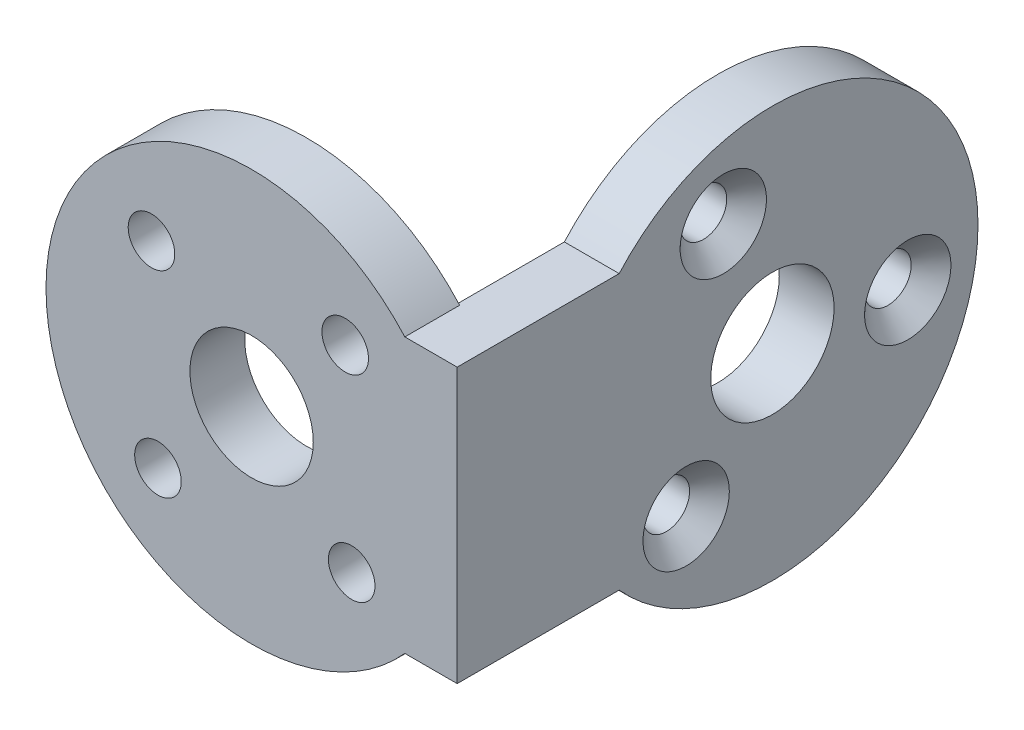
ISO-10303-21;
HEADER;
FILE_DESCRIPTION(('STEP AP214'),'2;1');
FILE_NAME('part.step','',(''),(''),'','','');
FILE_SCHEMA(('AUTOMOTIVE_DESIGN { 1 0 10303 214 1 1 1 1 }'));
ENDSEC;
DATA;
#1=APPLICATION_CONTEXT('core data for automotive mechanical design processes');
#2=APPLICATION_PROTOCOL_DEFINITION('international standard','automotive_design',2000,#1);
#3=PRODUCT_CONTEXT('',#1,'mechanical');
#4=PRODUCT('Part','Part','',(#3));
#5=PRODUCT_RELATED_PRODUCT_CATEGORY('part','',(#4));
#6=PRODUCT_DEFINITION_FORMATION('','',#4);
#7=PRODUCT_DEFINITION_CONTEXT('part definition',#1,'design');
#8=PRODUCT_DEFINITION('design','',#6,#7);
#9=PRODUCT_DEFINITION_SHAPE('','',#8);
#10=(LENGTH_UNIT() NAMED_UNIT(*) SI_UNIT(.MILLI.,.METRE.));
#11=(NAMED_UNIT(*) PLANE_ANGLE_UNIT() SI_UNIT($,.RADIAN.));
#12=(NAMED_UNIT(*) SI_UNIT($,.STERADIAN.) SOLID_ANGLE_UNIT());
#13=UNCERTAINTY_MEASURE_WITH_UNIT(LENGTH_MEASURE(1.E-05),#10,'distance_accuracy_value','');
#14=(GEOMETRIC_REPRESENTATION_CONTEXT(3) GLOBAL_UNCERTAINTY_ASSIGNED_CONTEXT((#13)) GLOBAL_UNIT_ASSIGNED_CONTEXT((#10,
#11,#12)) REPRESENTATION_CONTEXT('',''));
#15=CARTESIAN_POINT('',(0.,0.,0.));
#16=DIRECTION('',(0.,0.,1.));
#17=DIRECTION('',(1.,0.,0.));
#18=AXIS2_PLACEMENT_3D('',#15,#16,#17);
#19=CARTESIAN_POINT('',(0.,0.,4.));
#20=DIRECTION('',(0.,0.,1.));
#21=DIRECTION('',(1.,0.,0.));
#22=AXIS2_PLACEMENT_3D('',#19,#20,#21);
#23=PLANE('',#22);
#24=CARTESIAN_POINT('',(6.8308160540594,7.30342057091089,4.));
#25=DIRECTION('',(0.,0.,-1.));
#26=DIRECTION('',(-1.,0.,0.));
#27=AXIS2_PLACEMENT_3D('',#24,#25,#26);
#28=CIRCLE('',#27,1.7);
#29=CARTESIAN_POINT('',(5.1308160540594,7.30342057091089,4.));
#30=VERTEX_POINT('',#29);
#31=EDGE_CURVE('E177',#30,#30,#28,.T.);
#32=ORIENTED_EDGE('',*,*,#31,.T.);
#33=EDGE_LOOP('',(#32));
#34=FACE_BOUND('',#33,.T.);
#35=CARTESIAN_POINT('',(-7.30342057091105,6.83081605405923,4.));
#36=DIRECTION('',(0.,0.,-1.));
#37=DIRECTION('',(-1.,0.,0.));
#38=AXIS2_PLACEMENT_3D('',#35,#36,#37);
#39=CIRCLE('',#38,1.7);
#40=CARTESIAN_POINT('',(-9.00342057091105,6.83081605405923,4.));
#41=VERTEX_POINT('',#40);
#42=EDGE_CURVE('E186',#41,#41,#39,.T.);
#43=ORIENTED_EDGE('',*,*,#42,.T.);
#44=EDGE_LOOP('',(#43));
#45=FACE_BOUND('',#44,.T.);
#46=CARTESIAN_POINT('',(0.,0.,4.));
#47=DIRECTION('',(0.,0.,1.));
#48=DIRECTION('',(1.,0.,0.));
#49=AXIS2_PLACEMENT_3D('',#46,#47,#48);
#50=CIRCLE('',#49,15.);
#51=CARTESIAN_POINT('',(11.1803398874989,10.,4.));
#52=VERTEX_POINT('',#51);
#53=CARTESIAN_POINT('',(11.1803398874989,-10.,4.));
#54=VERTEX_POINT('',#53);
#55=EDGE_CURVE('E136',#52,#54,#50,.T.);
#56=ORIENTED_EDGE('',*,*,#55,.T.);
#57=DIRECTION('',(1.,0.,0.));
#58=VECTOR('',#57,1.);
#59=CARTESIAN_POINT('',(11.1803398874989,-10.,4.));
#60=LINE('',#59,#58);
#61=CARTESIAN_POINT('',(15.,-10.,4.));
#62=VERTEX_POINT('',#61);
#63=EDGE_CURVE('E138',#54,#62,#60,.T.);
#64=ORIENTED_EDGE('',*,*,#63,.T.);
#65=DIRECTION('',(0.,1.,0.));
#66=VECTOR('',#65,1.);
#67=CARTESIAN_POINT('',(15.,10.,4.));
#68=LINE('',#67,#66);
#69=CARTESIAN_POINT('',(15.,10.,4.));
#70=VERTEX_POINT('',#69);
#71=EDGE_CURVE('E56',#62,#70,#68,.T.);
#72=ORIENTED_EDGE('',*,*,#71,.T.);
#73=DIRECTION('',(-1.,0.,0.));
#74=VECTOR('',#73,1.);
#75=CARTESIAN_POINT('',(11.1803398874989,10.,4.));
#76=LINE('',#75,#74);
#77=EDGE_CURVE('E51',#70,#52,#76,.T.);
#78=ORIENTED_EDGE('',*,*,#77,.T.);
#79=EDGE_LOOP('',(#56,#64,#72,#78));
#80=FACE_BOUND('',#79,.T.);
#81=CARTESIAN_POINT('',(0.,0.,4.));
#82=DIRECTION('',(0.,0.,1.));
#83=DIRECTION('',(1.,0.,0.));
#84=AXIS2_PLACEMENT_3D('',#81,#82,#83);
#85=CIRCLE('',#84,4.5);
#86=CARTESIAN_POINT('',(4.5,0.,4.));
#87=VERTEX_POINT('',#86);
#88=EDGE_CURVE('E130',#87,#87,#85,.T.);
#89=ORIENTED_EDGE('',*,*,#88,.F.);
#90=EDGE_LOOP('',(#89));
#91=FACE_BOUND('',#90,.T.);
#92=CARTESIAN_POINT('',(7.30342057091089,-6.8308160540594,4.));
#93=DIRECTION('',(0.,0.,-1.));
#94=DIRECTION('',(-1.,0.,0.));
#95=AXIS2_PLACEMENT_3D('',#92,#93,#94);
#96=CIRCLE('',#95,1.7);
#97=CARTESIAN_POINT('',(5.60342057091089,-6.8308160540594,4.));
#98=VERTEX_POINT('',#97);
#99=EDGE_CURVE('E204',#98,#98,#96,.T.);
#100=ORIENTED_EDGE('',*,*,#99,.T.);
#101=EDGE_LOOP('',(#100));
#102=FACE_BOUND('',#101,.T.);
#103=CARTESIAN_POINT('',(-6.83081605405939,-7.30342057091089,4.));
#104=DIRECTION('',(0.,0.,-1.));
#105=DIRECTION('',(-1.,0.,0.));
#106=AXIS2_PLACEMENT_3D('',#103,#104,#105);
#107=CIRCLE('',#106,1.7);
#108=CARTESIAN_POINT('',(-8.5308160540594,-7.30342057091089,4.));
#109=VERTEX_POINT('',#108);
#110=EDGE_CURVE('E195',#109,#109,#107,.T.);
#111=ORIENTED_EDGE('',*,*,#110,.T.);
#112=EDGE_LOOP('',(#111));
#113=FACE_BOUND('',#112,.T.);
#114=ADVANCED_FACE('F34',(#34,#45,#80,#91,#102,#113),#23,.T.);
#115=CARTESIAN_POINT('',(0.,0.,0.));
#116=DIRECTION('',(0.,0.,1.));
#117=DIRECTION('',(1.,0.,0.));
#118=AXIS2_PLACEMENT_3D('',#115,#116,#117);
#119=PLANE('',#118);
#120=CARTESIAN_POINT('',(6.8308160540594,7.30342057091089,0.));
#121=DIRECTION('',(0.,0.,-1.));
#122=DIRECTION('',(-1.,0.,0.));
#123=AXIS2_PLACEMENT_3D('',#120,#121,#122);
#124=CIRCLE('',#123,3.15);
#125=CARTESIAN_POINT('',(3.6808160540594,7.30342057091089,0.));
#126=VERTEX_POINT('',#125);
#127=EDGE_CURVE('E151',#126,#126,#124,.T.);
#128=ORIENTED_EDGE('',*,*,#127,.F.);
#129=EDGE_LOOP('',(#128));
#130=FACE_BOUND('',#129,.T.);
#131=CARTESIAN_POINT('',(-7.30342057091105,6.83081605405923,0.));
#132=DIRECTION('',(0.,0.,-1.));
#133=DIRECTION('',(-1.,0.,0.));
#134=AXIS2_PLACEMENT_3D('',#131,#132,#133);
#135=CIRCLE('',#134,3.15);
#136=CARTESIAN_POINT('',(-10.4534205709111,6.83081605405923,0.));
#137=VERTEX_POINT('',#136);
#138=EDGE_CURVE('E180',#137,#137,#135,.T.);
#139=ORIENTED_EDGE('',*,*,#138,.F.);
#140=EDGE_LOOP('',(#139));
#141=FACE_BOUND('',#140,.T.);
#142=CARTESIAN_POINT('',(-6.83081605405939,-7.30342057091089,0.));
#143=DIRECTION('',(0.,0.,-1.));
#144=DIRECTION('',(-1.,0.,0.));
#145=AXIS2_PLACEMENT_3D('',#142,#143,#144);
#146=CIRCLE('',#145,3.15);
#147=CARTESIAN_POINT('',(-9.9808160540594,-7.30342057091089,0.));
#148=VERTEX_POINT('',#147);
#149=EDGE_CURVE('E189',#148,#148,#146,.T.);
#150=ORIENTED_EDGE('',*,*,#149,.F.);
#151=EDGE_LOOP('',(#150));
#152=FACE_BOUND('',#151,.T.);
#153=CARTESIAN_POINT('',(7.30342057091089,-6.8308160540594,0.));
#154=DIRECTION('',(0.,0.,-1.));
#155=DIRECTION('',(-1.,0.,0.));
#156=AXIS2_PLACEMENT_3D('',#153,#154,#155);
#157=CIRCLE('',#156,3.15);
#158=CARTESIAN_POINT('',(4.15342057091089,-6.8308160540594,0.));
#159=VERTEX_POINT('',#158);
#160=EDGE_CURVE('E198',#159,#159,#157,.T.);
#161=ORIENTED_EDGE('',*,*,#160,.F.);
#162=EDGE_LOOP('',(#161));
#163=FACE_BOUND('',#162,.T.);
#164=CARTESIAN_POINT('',(0.,0.,0.));
#165=DIRECTION('',(0.,0.,1.));
#166=DIRECTION('',(1.,0.,0.));
#167=AXIS2_PLACEMENT_3D('',#164,#165,#166);
#168=CIRCLE('',#167,4.5);
#169=CARTESIAN_POINT('',(4.5,0.,0.));
#170=VERTEX_POINT('',#169);
#171=EDGE_CURVE('E125',#170,#170,#168,.T.);
#172=ORIENTED_EDGE('',*,*,#171,.T.);
#173=EDGE_LOOP('',(#172));
#174=FACE_BOUND('',#173,.T.);
#175=DIRECTION('',(1.,0.,0.));
#176=VECTOR('',#175,1.);
#177=CARTESIAN_POINT('',(11.,10.,0.));
#178=LINE('',#177,#176);
#179=CARTESIAN_POINT('',(11.,10.,0.));
#180=VERTEX_POINT('',#179);
#181=CARTESIAN_POINT('',(11.1803398874989,10.,0.));
#182=VERTEX_POINT('',#181);
#183=EDGE_CURVE('E112',#180,#182,#178,.T.);
#184=ORIENTED_EDGE('',*,*,#183,.F.);
#185=DIRECTION('',(0.,-1.,0.));
#186=VECTOR('',#185,1.);
#187=CARTESIAN_POINT('',(11.,10.,0.));
#188=LINE('',#187,#186);
#189=CARTESIAN_POINT('',(11.,-10.,0.));
#190=VERTEX_POINT('',#189);
#191=EDGE_CURVE('E105',#180,#190,#188,.T.);
#192=ORIENTED_EDGE('',*,*,#191,.T.);
#193=DIRECTION('',(1.,0.,0.));
#194=VECTOR('',#193,1.);
#195=CARTESIAN_POINT('',(11.,-10.,0.));
#196=LINE('',#195,#194);
#197=CARTESIAN_POINT('',(11.1803398874989,-10.,0.));
#198=VERTEX_POINT('',#197);
#199=EDGE_CURVE('E88',#190,#198,#196,.T.);
#200=ORIENTED_EDGE('',*,*,#199,.T.);
#201=CARTESIAN_POINT('',(0.,0.,0.));
#202=DIRECTION('',(0.,0.,1.));
#203=DIRECTION('',(1.,0.,0.));
#204=AXIS2_PLACEMENT_3D('',#201,#202,#203);
#205=CIRCLE('',#204,15.);
#206=EDGE_CURVE('E133',#182,#198,#205,.T.);
#207=ORIENTED_EDGE('',*,*,#206,.F.);
#208=EDGE_LOOP('',(#184,#192,#200,#207));
#209=FACE_BOUND('',#208,.T.);
#210=ADVANCED_FACE('F111',(#130,#141,#152,#163,#174,#209),#119,.F.);
#211=CARTESIAN_POINT('',(0.,0.,4.));
#212=DIRECTION('',(0.,0.,-1.));
#213=DIRECTION('',(-1.,0.,0.));
#214=AXIS2_PLACEMENT_3D('',#211,#212,#213);
#215=CYLINDRICAL_SURFACE('',#214,15.);
#216=ORIENTED_EDGE('',*,*,#206,.T.);
#217=DIRECTION('',(0.,0.,-1.));
#218=VECTOR('',#217,1.);
#219=CARTESIAN_POINT('',(11.1803398874989,-10.,4.));
#220=LINE('',#219,#218);
#221=EDGE_CURVE('E11',#54,#198,#220,.T.);
#222=ORIENTED_EDGE('',*,*,#221,.F.);
#223=ORIENTED_EDGE('',*,*,#55,.F.);
#224=DIRECTION('',(0.,0.,-1.));
#225=VECTOR('',#224,1.);
#226=CARTESIAN_POINT('',(11.1803398874989,10.,4.));
#227=LINE('',#226,#225);
#228=EDGE_CURVE('E142',#52,#182,#227,.T.);
#229=ORIENTED_EDGE('',*,*,#228,.T.);
#230=EDGE_LOOP('',(#216,#222,#223,#229));
#231=FACE_BOUND('',#230,.T.);
#232=ADVANCED_FACE('F36',(#231),#215,.T.);
#233=CARTESIAN_POINT('',(11.1803398874989,-10.,4.));
#234=DIRECTION('',(0.,1.,0.));
#235=DIRECTION('',(0.,0.,1.));
#236=AXIS2_PLACEMENT_3D('',#233,#234,#235);
#237=PLANE('',#236);
#238=ORIENTED_EDGE('',*,*,#221,.T.);
#239=ORIENTED_EDGE('',*,*,#199,.F.);
#240=DIRECTION('',(0.,0.,-1.));
#241=VECTOR('',#240,1.);
#242=CARTESIAN_POINT('',(11.,-10.,0.));
#243=LINE('',#242,#241);
#244=CARTESIAN_POINT('',(11.,-10.,-7.81966011250106));
#245=VERTEX_POINT('',#244);
#246=EDGE_CURVE('E92',#190,#245,#243,.T.);
#247=ORIENTED_EDGE('',*,*,#246,.T.);
#248=DIRECTION('',(1.,0.,0.));
#249=VECTOR('',#248,1.);
#250=CARTESIAN_POINT('',(11.,-10.,-7.81966011250106));
#251=LINE('',#250,#249);
#252=CARTESIAN_POINT('',(15.,-10.,-7.81966011250106));
#253=VERTEX_POINT('',#252);
#254=EDGE_CURVE('E98',#245,#253,#251,.T.);
#255=ORIENTED_EDGE('',*,*,#254,.T.);
#256=DIRECTION('',(0.,0.,-1.));
#257=VECTOR('',#256,1.);
#258=CARTESIAN_POINT('',(15.,-10.,4.));
#259=LINE('',#258,#257);
#260=EDGE_CURVE('E43',#62,#253,#259,.T.);
#261=ORIENTED_EDGE('',*,*,#260,.F.);
#262=ORIENTED_EDGE('',*,*,#63,.F.);
#263=EDGE_LOOP('',(#238,#239,#247,#255,#261,#262));
#264=FACE_BOUND('',#263,.T.);
#265=ADVANCED_FACE('F90',(#264),#237,.F.);
#266=CARTESIAN_POINT('',(15.,10.,4.));
#267=DIRECTION('',(-1.,0.,0.));
#268=DIRECTION('',(0.,0.,1.));
#269=AXIS2_PLACEMENT_3D('',#266,#267,#268);
#270=PLANE('',#269);
#271=CARTESIAN_POINT('',(15.,9.3358000491003,-15.416309521845));
#272=DIRECTION('',(1.,0.,0.));
#273=DIRECTION('',(0.,0.,-1.));
#274=AXIS2_PLACEMENT_3D('',#271,#272,#273);
#275=CIRCLE('',#274,3.15);
#276=CARTESIAN_POINT('',(15.,9.3358000491003,-18.566309521845));
#277=VERTEX_POINT('',#276);
#278=EDGE_CURVE('E312',#277,#277,#275,.T.);
#279=ORIENTED_EDGE('',*,*,#278,.F.);
#280=EDGE_LOOP('',(#279));
#281=FACE_BOUND('',#280,.T.);
#282=CARTESIAN_POINT('',(15.,-1.56433303116751,-28.8768852462504));
#283=DIRECTION('',(1.,0.,0.));
#284=DIRECTION('',(0.,0.,-1.));
#285=AXIS2_PLACEMENT_3D('',#282,#283,#284);
#286=CIRCLE('',#285,3.15);
#287=CARTESIAN_POINT('',(15.,-1.56433303116751,-32.0268852462504));
#288=VERTEX_POINT('',#287);
#289=EDGE_CURVE('E162',#288,#288,#286,.T.);
#290=ORIENTED_EDGE('',*,*,#289,.F.);
#291=EDGE_LOOP('',(#290));
#292=FACE_BOUND('',#291,.T.);
#293=CARTESIAN_POINT('',(15.,-7.77146701793279,-12.7068052319046));
#294=DIRECTION('',(1.,0.,0.));
#295=DIRECTION('',(0.,0.,-1.));
#296=AXIS2_PLACEMENT_3D('',#293,#294,#295);
#297=CIRCLE('',#296,3.15);
#298=CARTESIAN_POINT('',(15.,-7.77146701793279,-15.8568052319046));
#299=VERTEX_POINT('',#298);
#300=EDGE_CURVE('E155',#299,#299,#297,.T.);
#301=ORIENTED_EDGE('',*,*,#300,.F.);
#302=EDGE_LOOP('',(#301));
#303=FACE_BOUND('',#302,.T.);
#304=ORIENTED_EDGE('',*,*,#260,.T.);
#305=CARTESIAN_POINT('',(15.,0.,-19.));
#306=DIRECTION('',(1.,0.,0.));
#307=DIRECTION('',(0.,0.,1.));
#308=AXIS2_PLACEMENT_3D('',#305,#306,#307);
#309=CIRCLE('',#308,15.);
#310=CARTESIAN_POINT('',(15.,10.,-7.81966011250105));
#311=VERTEX_POINT('',#310);
#312=EDGE_CURVE('E113',#253,#311,#309,.T.);
#313=ORIENTED_EDGE('',*,*,#312,.T.);
#314=DIRECTION('',(0.,0.,-1.));
#315=VECTOR('',#314,1.);
#316=CARTESIAN_POINT('',(15.,10.,4.));
#317=LINE('',#316,#315);
#318=EDGE_CURVE('E146',#70,#311,#317,.T.);
#319=ORIENTED_EDGE('',*,*,#318,.F.);
#320=ORIENTED_EDGE('',*,*,#71,.F.);
#321=EDGE_LOOP('',(#304,#313,#319,#320));
#322=FACE_BOUND('',#321,.T.);
#323=CARTESIAN_POINT('',(15.,0.,-19.));
#324=DIRECTION('',(1.,0.,0.));
#325=DIRECTION('',(0.,0.,-1.));
#326=AXIS2_PLACEMENT_3D('',#323,#324,#325);
#327=CIRCLE('',#326,4.5);
#328=CARTESIAN_POINT('',(15.,0.,-23.5));
#329=VERTEX_POINT('',#328);
#330=EDGE_CURVE('E119',#329,#329,#327,.T.);
#331=ORIENTED_EDGE('',*,*,#330,.F.);
#332=EDGE_LOOP('',(#331));
#333=FACE_BOUND('',#332,.T.);
#334=ADVANCED_FACE('F214',(#281,#292,#303,#322,#333),#270,.F.);
#335=CARTESIAN_POINT('',(11.1803398874989,10.,4.));
#336=DIRECTION('',(0.,-1.,0.));
#337=DIRECTION('',(0.,0.,-1.));
#338=AXIS2_PLACEMENT_3D('',#335,#336,#337);
#339=PLANE('',#338);
#340=ORIENTED_EDGE('',*,*,#318,.T.);
#341=DIRECTION('',(1.,0.,0.));
#342=VECTOR('',#341,1.);
#343=CARTESIAN_POINT('',(11.,10.,-7.81966011250105));
#344=LINE('',#343,#342);
#345=CARTESIAN_POINT('',(11.,10.,-7.81966011250105));
#346=VERTEX_POINT('',#345);
#347=EDGE_CURVE('E126',#346,#311,#344,.T.);
#348=ORIENTED_EDGE('',*,*,#347,.F.);
#349=DIRECTION('',(0.,0.,1.));
#350=VECTOR('',#349,1.);
#351=CARTESIAN_POINT('',(11.,10.,0.));
#352=LINE('',#351,#350);
#353=EDGE_CURVE('E99',#346,#180,#352,.T.);
#354=ORIENTED_EDGE('',*,*,#353,.T.);
#355=ORIENTED_EDGE('',*,*,#183,.T.);
#356=ORIENTED_EDGE('',*,*,#228,.F.);
#357=ORIENTED_EDGE('',*,*,#77,.F.);
#358=EDGE_LOOP('',(#340,#348,#354,#355,#356,#357));
#359=FACE_BOUND('',#358,.T.);
#360=ADVANCED_FACE('F216',(#359),#339,.F.);
#361=CARTESIAN_POINT('',(0.,0.,4.));
#362=DIRECTION('',(0.,0.,-1.));
#363=DIRECTION('',(-1.,0.,0.));
#364=AXIS2_PLACEMENT_3D('',#361,#362,#363);
#365=CYLINDRICAL_SURFACE('',#364,4.5);
#366=ORIENTED_EDGE('',*,*,#88,.T.);
#367=EDGE_LOOP('',(#366));
#368=FACE_BOUND('',#367,.T.);
#369=ORIENTED_EDGE('',*,*,#171,.F.);
#370=EDGE_LOOP('',(#369));
#371=FACE_BOUND('',#370,.T.);
#372=ADVANCED_FACE('F223',(#368,#371),#365,.F.);
#373=CARTESIAN_POINT('',(11.,0.,-19.));
#374=DIRECTION('',(1.,0.,0.));
#375=DIRECTION('',(0.,0.,-1.));
#376=AXIS2_PLACEMENT_3D('',#373,#374,#375);
#377=CYLINDRICAL_SURFACE('',#376,15.);
#378=ORIENTED_EDGE('',*,*,#312,.F.);
#379=ORIENTED_EDGE('',*,*,#254,.F.);
#380=CARTESIAN_POINT('',(11.,0.,-19.));
#381=DIRECTION('',(1.,0.,0.));
#382=DIRECTION('',(0.,0.,1.));
#383=AXIS2_PLACEMENT_3D('',#380,#381,#382);
#384=CIRCLE('',#383,15.);
#385=EDGE_CURVE('E108',#245,#346,#384,.T.);
#386=ORIENTED_EDGE('',*,*,#385,.T.);
#387=ORIENTED_EDGE('',*,*,#347,.T.);
#388=EDGE_LOOP('',(#378,#379,#386,#387));
#389=FACE_BOUND('',#388,.T.);
#390=ADVANCED_FACE('F240',(#389),#377,.T.);
#391=CARTESIAN_POINT('',(11.,0.,-19.));
#392=DIRECTION('',(-1.,0.,0.));
#393=DIRECTION('',(0.,0.,1.));
#394=AXIS2_PLACEMENT_3D('',#391,#392,#393);
#395=PLANE('',#394);
#396=CARTESIAN_POINT('',(11.,9.3358000491003,-15.416309521845));
#397=DIRECTION('',(-1.,0.,0.));
#398=DIRECTION('',(0.,0.,1.));
#399=AXIS2_PLACEMENT_3D('',#396,#397,#398);
#400=CIRCLE('',#399,1.69999999999999);
#401=CARTESIAN_POINT('',(11.,9.3358000491003,-13.716309521845));
#402=VERTEX_POINT('',#401);
#403=EDGE_CURVE('E38',#402,#402,#400,.T.);
#404=ORIENTED_EDGE('',*,*,#403,.F.);
#405=EDGE_LOOP('',(#404));
#406=FACE_BOUND('',#405,.T.);
#407=CARTESIAN_POINT('',(11.,-1.56433303116751,-28.8768852462504));
#408=DIRECTION('',(-1.,0.,0.));
#409=DIRECTION('',(0.,0.,1.));
#410=AXIS2_PLACEMENT_3D('',#407,#408,#409);
#411=CIRCLE('',#410,1.69999999999999);
#412=CARTESIAN_POINT('',(11.,-1.56433303116751,-27.1768852462504));
#413=VERTEX_POINT('',#412);
#414=EDGE_CURVE('E153',#413,#413,#411,.T.);
#415=ORIENTED_EDGE('',*,*,#414,.F.);
#416=EDGE_LOOP('',(#415));
#417=FACE_BOUND('',#416,.T.);
#418=CARTESIAN_POINT('',(11.,-7.77146701793279,-12.7068052319046));
#419=DIRECTION('',(-1.,0.,0.));
#420=DIRECTION('',(0.,0.,1.));
#421=AXIS2_PLACEMENT_3D('',#418,#419,#420);
#422=CIRCLE('',#421,1.69999999999999);
#423=CARTESIAN_POINT('',(11.,-7.77146701793279,-11.0068052319046));
#424=VERTEX_POINT('',#423);
#425=EDGE_CURVE('E149',#424,#424,#422,.T.);
#426=ORIENTED_EDGE('',*,*,#425,.F.);
#427=EDGE_LOOP('',(#426));
#428=FACE_BOUND('',#427,.T.);
#429=CARTESIAN_POINT('',(11.,0.,-19.));
#430=DIRECTION('',(1.,0.,0.));
#431=DIRECTION('',(0.,0.,-1.));
#432=AXIS2_PLACEMENT_3D('',#429,#430,#431);
#433=CIRCLE('',#432,4.5);
#434=CARTESIAN_POINT('',(11.,0.,-23.5));
#435=VERTEX_POINT('',#434);
#436=EDGE_CURVE('E116',#435,#435,#433,.T.);
#437=ORIENTED_EDGE('',*,*,#436,.T.);
#438=EDGE_LOOP('',(#437));
#439=FACE_BOUND('',#438,.T.);
#440=ORIENTED_EDGE('',*,*,#191,.F.);
#441=ORIENTED_EDGE('',*,*,#353,.F.);
#442=ORIENTED_EDGE('',*,*,#385,.F.);
#443=ORIENTED_EDGE('',*,*,#246,.F.);
#444=EDGE_LOOP('',(#440,#441,#442,#443));
#445=FACE_BOUND('',#444,.T.);
#446=ADVANCED_FACE('F103',(#406,#417,#428,#439,#445),#395,.T.);
#447=CARTESIAN_POINT('',(11.,0.,-19.));
#448=DIRECTION('',(1.,0.,0.));
#449=DIRECTION('',(0.,0.,-1.));
#450=AXIS2_PLACEMENT_3D('',#447,#448,#449);
#451=CYLINDRICAL_SURFACE('',#450,4.5);
#452=ORIENTED_EDGE('',*,*,#436,.F.);
#453=EDGE_LOOP('',(#452));
#454=FACE_BOUND('',#453,.T.);
#455=ORIENTED_EDGE('',*,*,#330,.T.);
#456=EDGE_LOOP('',(#455));
#457=FACE_BOUND('',#456,.T.);
#458=ADVANCED_FACE('F212',(#454,#457),#451,.F.);
#459=CARTESIAN_POINT('',(7.30342057091089,-6.8308160540594,0.));
#460=DIRECTION('',(0.,0.,-1.));
#461=DIRECTION('',(-1.,0.,0.));
#462=AXIS2_PLACEMENT_3D('',#459,#460,#461);
#463=CYLINDRICAL_SURFACE('',#462,1.7);
#464=ORIENTED_EDGE('',*,*,#99,.F.);
#465=EDGE_LOOP('',(#464));
#466=FACE_BOUND('',#465,.T.);
#467=CARTESIAN_POINT('',(7.30342057091089,-6.8308160540594,1.45));
#468=DIRECTION('',(0.,0.,-1.));
#469=DIRECTION('',(-1.,0.,0.));
#470=AXIS2_PLACEMENT_3D('',#467,#468,#469);
#471=CIRCLE('',#470,1.7);
#472=CARTESIAN_POINT('',(5.60342057091089,-6.8308160540594,1.45));
#473=VERTEX_POINT('',#472);
#474=EDGE_CURVE('E201',#473,#473,#471,.T.);
#475=ORIENTED_EDGE('',*,*,#474,.T.);
#476=EDGE_LOOP('',(#475));
#477=FACE_BOUND('',#476,.T.);
#478=ADVANCED_FACE('F250',(#466,#477),#463,.F.);
#479=CARTESIAN_POINT('',(7.30342057091089,-6.8308160540594,0.));
#480=DIRECTION('',(0.,0.,-1.));
#481=DIRECTION('',(-1.,0.,0.));
#482=AXIS2_PLACEMENT_3D('',#479,#480,#481);
#483=CONICAL_SURFACE('',#482,3.15,0.785398163397448);
#484=ORIENTED_EDGE('',*,*,#474,.F.);
#485=EDGE_LOOP('',(#484));
#486=FACE_BOUND('',#485,.T.);
#487=ORIENTED_EDGE('',*,*,#160,.T.);
#488=EDGE_LOOP('',(#487));
#489=FACE_BOUND('',#488,.T.);
#490=ADVANCED_FACE('F254',(#486,#489),#483,.F.);
#491=CARTESIAN_POINT('',(-6.83081605405939,-7.30342057091089,0.));
#492=DIRECTION('',(0.,0.,-1.));
#493=DIRECTION('',(-1.,0.,0.));
#494=AXIS2_PLACEMENT_3D('',#491,#492,#493);
#495=CYLINDRICAL_SURFACE('',#494,1.7);
#496=ORIENTED_EDGE('',*,*,#110,.F.);
#497=EDGE_LOOP('',(#496));
#498=FACE_BOUND('',#497,.T.);
#499=CARTESIAN_POINT('',(-6.83081605405939,-7.30342057091089,1.45));
#500=DIRECTION('',(0.,0.,-1.));
#501=DIRECTION('',(-1.,0.,0.));
#502=AXIS2_PLACEMENT_3D('',#499,#500,#501);
#503=CIRCLE('',#502,1.7);
#504=CARTESIAN_POINT('',(-8.5308160540594,-7.30342057091089,1.45));
#505=VERTEX_POINT('',#504);
#506=EDGE_CURVE('E192',#505,#505,#503,.T.);
#507=ORIENTED_EDGE('',*,*,#506,.T.);
#508=EDGE_LOOP('',(#507));
#509=FACE_BOUND('',#508,.T.);
#510=ADVANCED_FACE('F258',(#498,#509),#495,.F.);
#511=CARTESIAN_POINT('',(-6.83081605405939,-7.30342057091089,0.));
#512=DIRECTION('',(0.,0.,-1.));
#513=DIRECTION('',(-1.,0.,0.));
#514=AXIS2_PLACEMENT_3D('',#511,#512,#513);
#515=CONICAL_SURFACE('',#514,3.15,0.785398163397448);
#516=ORIENTED_EDGE('',*,*,#506,.F.);
#517=EDGE_LOOP('',(#516));
#518=FACE_BOUND('',#517,.T.);
#519=ORIENTED_EDGE('',*,*,#149,.T.);
#520=EDGE_LOOP('',(#519));
#521=FACE_BOUND('',#520,.T.);
#522=ADVANCED_FACE('F262',(#518,#521),#515,.F.);
#523=CARTESIAN_POINT('',(-7.30342057091105,6.83081605405923,0.));
#524=DIRECTION('',(0.,0.,-1.));
#525=DIRECTION('',(-1.,0.,0.));
#526=AXIS2_PLACEMENT_3D('',#523,#524,#525);
#527=CYLINDRICAL_SURFACE('',#526,1.7);
#528=ORIENTED_EDGE('',*,*,#42,.F.);
#529=EDGE_LOOP('',(#528));
#530=FACE_BOUND('',#529,.T.);
#531=CARTESIAN_POINT('',(-7.30342057091105,6.83081605405923,1.45));
#532=DIRECTION('',(0.,0.,-1.));
#533=DIRECTION('',(-1.,0.,0.));
#534=AXIS2_PLACEMENT_3D('',#531,#532,#533);
#535=CIRCLE('',#534,1.7);
#536=CARTESIAN_POINT('',(-9.00342057091105,6.83081605405923,1.45));
#537=VERTEX_POINT('',#536);
#538=EDGE_CURVE('E183',#537,#537,#535,.T.);
#539=ORIENTED_EDGE('',*,*,#538,.T.);
#540=EDGE_LOOP('',(#539));
#541=FACE_BOUND('',#540,.T.);
#542=ADVANCED_FACE('F266',(#530,#541),#527,.F.);
#543=CARTESIAN_POINT('',(-7.30342057091105,6.83081605405923,0.));
#544=DIRECTION('',(0.,0.,-1.));
#545=DIRECTION('',(-1.,0.,0.));
#546=AXIS2_PLACEMENT_3D('',#543,#544,#545);
#547=CONICAL_SURFACE('',#546,3.15,0.785398163397448);
#548=ORIENTED_EDGE('',*,*,#538,.F.);
#549=EDGE_LOOP('',(#548));
#550=FACE_BOUND('',#549,.T.);
#551=ORIENTED_EDGE('',*,*,#138,.T.);
#552=EDGE_LOOP('',(#551));
#553=FACE_BOUND('',#552,.T.);
#554=ADVANCED_FACE('F270',(#550,#553),#547,.F.);
#555=CARTESIAN_POINT('',(6.8308160540594,7.30342057091089,0.));
#556=DIRECTION('',(0.,0.,-1.));
#557=DIRECTION('',(-1.,0.,0.));
#558=AXIS2_PLACEMENT_3D('',#555,#556,#557);
#559=CYLINDRICAL_SURFACE('',#558,1.7);
#560=ORIENTED_EDGE('',*,*,#31,.F.);
#561=EDGE_LOOP('',(#560));
#562=FACE_BOUND('',#561,.T.);
#563=CARTESIAN_POINT('',(6.8308160540594,7.30342057091089,1.45));
#564=DIRECTION('',(0.,0.,-1.));
#565=DIRECTION('',(-1.,0.,0.));
#566=AXIS2_PLACEMENT_3D('',#563,#564,#565);
#567=CIRCLE('',#566,1.7);
#568=CARTESIAN_POINT('',(5.1308160540594,7.30342057091089,1.45));
#569=VERTEX_POINT('',#568);
#570=EDGE_CURVE('E174',#569,#569,#567,.T.);
#571=ORIENTED_EDGE('',*,*,#570,.T.);
#572=EDGE_LOOP('',(#571));
#573=FACE_BOUND('',#572,.T.);
#574=ADVANCED_FACE('F274',(#562,#573),#559,.F.);
#575=CARTESIAN_POINT('',(6.8308160540594,7.30342057091089,0.));
#576=DIRECTION('',(0.,0.,-1.));
#577=DIRECTION('',(-1.,0.,0.));
#578=AXIS2_PLACEMENT_3D('',#575,#576,#577);
#579=CONICAL_SURFACE('',#578,3.15,0.785398163397448);
#580=ORIENTED_EDGE('',*,*,#570,.F.);
#581=EDGE_LOOP('',(#580));
#582=FACE_BOUND('',#581,.T.);
#583=ORIENTED_EDGE('',*,*,#127,.T.);
#584=EDGE_LOOP('',(#583));
#585=FACE_BOUND('',#584,.T.);
#586=ADVANCED_FACE('F278',(#582,#585),#579,.F.);
#587=CARTESIAN_POINT('',(15.,-7.77146701793279,-12.7068052319046));
#588=DIRECTION('',(1.,0.,0.));
#589=DIRECTION('',(0.,0.,-1.));
#590=AXIS2_PLACEMENT_3D('',#587,#588,#589);
#591=CYLINDRICAL_SURFACE('',#590,1.69999999999999);
#592=ORIENTED_EDGE('',*,*,#425,.T.);
#593=EDGE_LOOP('',(#592));
#594=FACE_BOUND('',#593,.T.);
#595=CARTESIAN_POINT('',(13.55,-7.77146701793279,-12.7068052319046));
#596=DIRECTION('',(1.,0.,0.));
#597=DIRECTION('',(0.,0.,-1.));
#598=AXIS2_PLACEMENT_3D('',#595,#596,#597);
#599=CIRCLE('',#598,1.69999999999999);
#600=CARTESIAN_POINT('',(13.55,-7.77146701793279,-14.4068052319046));
#601=VERTEX_POINT('',#600);
#602=EDGE_CURVE('E152',#601,#601,#599,.T.);
#603=ORIENTED_EDGE('',*,*,#602,.T.);
#604=EDGE_LOOP('',(#603));
#605=FACE_BOUND('',#604,.T.);
#606=ADVANCED_FACE('F282',(#594,#605),#591,.F.);
#607=CARTESIAN_POINT('',(15.,-7.77146701793279,-12.7068052319046));
#608=DIRECTION('',(1.,0.,0.));
#609=DIRECTION('',(0.,0.,-1.));
#610=AXIS2_PLACEMENT_3D('',#607,#608,#609);
#611=CONICAL_SURFACE('',#610,3.15,0.78539816339745);
#612=ORIENTED_EDGE('',*,*,#602,.F.);
#613=EDGE_LOOP('',(#612));
#614=FACE_BOUND('',#613,.T.);
#615=ORIENTED_EDGE('',*,*,#300,.T.);
#616=EDGE_LOOP('',(#615));
#617=FACE_BOUND('',#616,.T.);
#618=ADVANCED_FACE('F286',(#614,#617),#611,.F.);
#619=CARTESIAN_POINT('',(15.,-1.56433303116751,-28.8768852462504));
#620=DIRECTION('',(1.,0.,0.));
#621=DIRECTION('',(0.,0.,-1.));
#622=AXIS2_PLACEMENT_3D('',#619,#620,#621);
#623=CYLINDRICAL_SURFACE('',#622,1.69999999999999);
#624=ORIENTED_EDGE('',*,*,#414,.T.);
#625=EDGE_LOOP('',(#624));
#626=FACE_BOUND('',#625,.T.);
#627=CARTESIAN_POINT('',(13.55,-1.56433303116751,-28.8768852462504));
#628=DIRECTION('',(1.,0.,0.));
#629=DIRECTION('',(0.,0.,-1.));
#630=AXIS2_PLACEMENT_3D('',#627,#628,#629);
#631=CIRCLE('',#630,1.69999999999999);
#632=CARTESIAN_POINT('',(13.55,-1.56433303116751,-30.5768852462504));
#633=VERTEX_POINT('',#632);
#634=EDGE_CURVE('E156',#633,#633,#631,.T.);
#635=ORIENTED_EDGE('',*,*,#634,.T.);
#636=EDGE_LOOP('',(#635));
#637=FACE_BOUND('',#636,.T.);
#638=ADVANCED_FACE('F290',(#626,#637),#623,.F.);
#639=CARTESIAN_POINT('',(15.,-1.56433303116751,-28.8768852462504));
#640=DIRECTION('',(1.,0.,0.));
#641=DIRECTION('',(0.,0.,-1.));
#642=AXIS2_PLACEMENT_3D('',#639,#640,#641);
#643=CONICAL_SURFACE('',#642,3.15,0.78539816339745);
#644=ORIENTED_EDGE('',*,*,#634,.F.);
#645=EDGE_LOOP('',(#644));
#646=FACE_BOUND('',#645,.T.);
#647=ORIENTED_EDGE('',*,*,#289,.T.);
#648=EDGE_LOOP('',(#647));
#649=FACE_BOUND('',#648,.T.);
#650=ADVANCED_FACE('F294',(#646,#649),#643,.F.);
#651=CARTESIAN_POINT('',(15.,9.3358000491003,-15.416309521845));
#652=DIRECTION('',(1.,0.,0.));
#653=DIRECTION('',(0.,0.,-1.));
#654=AXIS2_PLACEMENT_3D('',#651,#652,#653);
#655=CYLINDRICAL_SURFACE('',#654,1.69999999999999);
#656=ORIENTED_EDGE('',*,*,#403,.T.);
#657=EDGE_LOOP('',(#656));
#658=FACE_BOUND('',#657,.T.);
#659=CARTESIAN_POINT('',(13.55,9.3358000491003,-15.416309521845));
#660=DIRECTION('',(1.,0.,0.));
#661=DIRECTION('',(0.,0.,-1.));
#662=AXIS2_PLACEMENT_3D('',#659,#660,#661);
#663=CIRCLE('',#662,1.69999999999999);
#664=CARTESIAN_POINT('',(13.55,9.3358000491003,-17.116309521845));
#665=VERTEX_POINT('',#664);
#666=EDGE_CURVE('E310',#665,#665,#663,.T.);
#667=ORIENTED_EDGE('',*,*,#666,.T.);
#668=EDGE_LOOP('',(#667));
#669=FACE_BOUND('',#668,.T.);
#670=ADVANCED_FACE('F297',(#658,#669),#655,.F.);
#671=CARTESIAN_POINT('',(15.,9.3358000491003,-15.416309521845));
#672=DIRECTION('',(1.,0.,0.));
#673=DIRECTION('',(0.,0.,-1.));
#674=AXIS2_PLACEMENT_3D('',#671,#672,#673);
#675=CONICAL_SURFACE('',#674,3.15,0.78539816339745);
#676=ORIENTED_EDGE('',*,*,#666,.F.);
#677=EDGE_LOOP('',(#676));
#678=FACE_BOUND('',#677,.T.);
#679=ORIENTED_EDGE('',*,*,#278,.T.);
#680=EDGE_LOOP('',(#679));
#681=FACE_BOUND('',#680,.T.);
#682=ADVANCED_FACE('F301',(#678,#681),#675,.F.);
#683=CLOSED_SHELL('',(#114,#210,#232,#265,#334,#360,#372,#390,#446,#458,#478,#490,#510,#522,
#542,#554,#574,#586,#606,#618,#638,#650,#670,#682));
#684=MANIFOLD_SOLID_BREP('B2',#683);
#685=ADVANCED_BREP_SHAPE_REPRESENTATION('',(#18,#684),#14);
#686=SHAPE_DEFINITION_REPRESENTATION(#9,#685);
ENDSEC;
END-ISO-10303-21;
